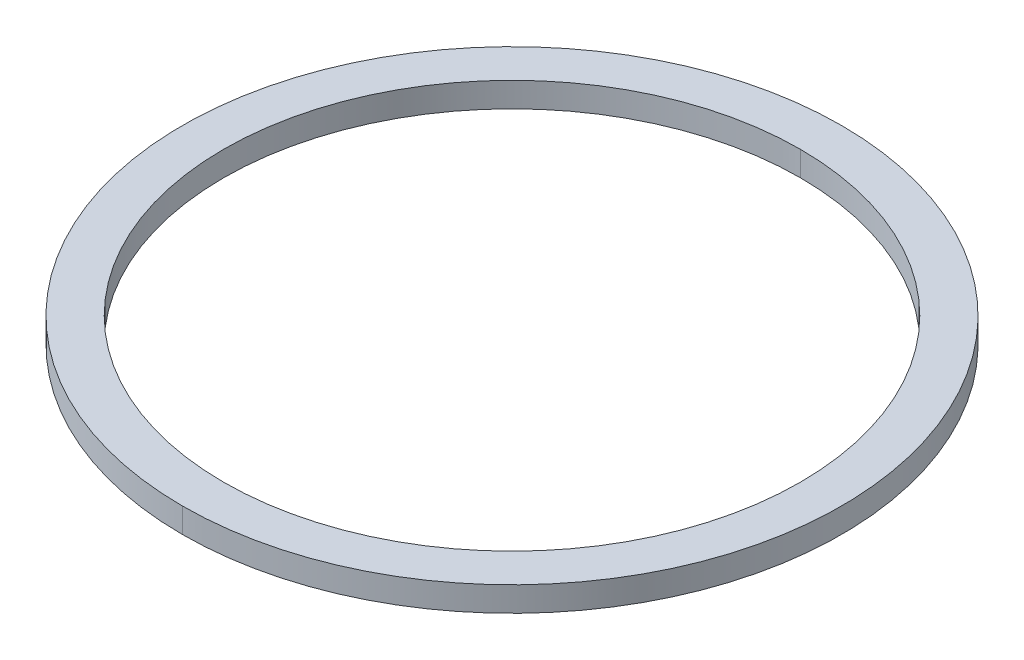
ISO-10303-21;
HEADER;
FILE_DESCRIPTION(('STEP AP214'),'2;1');
FILE_NAME('part.step','',(''),(''),'','','');
FILE_SCHEMA(('AUTOMOTIVE_DESIGN { 1 0 10303 214 1 1 1 1 }'));
ENDSEC;
DATA;
#1=APPLICATION_CONTEXT('core data for automotive mechanical design processes');
#2=APPLICATION_PROTOCOL_DEFINITION('international standard','automotive_design',2000,#1);
#3=PRODUCT_CONTEXT('',#1,'mechanical');
#4=PRODUCT('Part','Part','',(#3));
#5=PRODUCT_RELATED_PRODUCT_CATEGORY('part','',(#4));
#6=PRODUCT_DEFINITION_FORMATION('','',#4);
#7=PRODUCT_DEFINITION_CONTEXT('part definition',#1,'design');
#8=PRODUCT_DEFINITION('design','',#6,#7);
#9=PRODUCT_DEFINITION_SHAPE('','',#8);
#10=(LENGTH_UNIT() NAMED_UNIT(*) SI_UNIT(.MILLI.,.METRE.));
#11=(NAMED_UNIT(*) PLANE_ANGLE_UNIT() SI_UNIT($,.RADIAN.));
#12=(NAMED_UNIT(*) SI_UNIT($,.STERADIAN.) SOLID_ANGLE_UNIT());
#13=UNCERTAINTY_MEASURE_WITH_UNIT(LENGTH_MEASURE(1.E-05),#10,'distance_accuracy_value','');
#14=(GEOMETRIC_REPRESENTATION_CONTEXT(3) GLOBAL_UNCERTAINTY_ASSIGNED_CONTEXT((#13)) GLOBAL_UNIT_ASSIGNED_CONTEXT((#10,
#11,#12)) REPRESENTATION_CONTEXT('',''));
#15=CARTESIAN_POINT('',(0.,0.,0.));
#16=DIRECTION('',(0.,0.,1.));
#17=DIRECTION('',(1.,0.,0.));
#18=AXIS2_PLACEMENT_3D('',#15,#16,#17);
#19=CARTESIAN_POINT('',(0.,1.5,0.));
#20=DIRECTION('',(0.,-1.,0.));
#21=DIRECTION('',(0.,0.,-1.));
#22=AXIS2_PLACEMENT_3D('',#19,#20,#21);
#23=CYLINDRICAL_SURFACE('',#22,17.5);
#24=DIRECTION('',(0.,-1.,0.));
#25=VECTOR('',#24,1.);
#26=CARTESIAN_POINT('',(0.,1.5,17.5));
#27=LINE('',#26,#25);
#28=CARTESIAN_POINT('',(0.,1.5,17.5));
#29=VERTEX_POINT('',#28);
#30=CARTESIAN_POINT('',(0.,0.,17.5));
#31=VERTEX_POINT('',#30);
#32=EDGE_CURVE('E87',#29,#31,#27,.T.);
#33=ORIENTED_EDGE('',*,*,#32,.F.);
#34=CARTESIAN_POINT('',(0.,1.5,0.));
#35=DIRECTION('',(0.,1.,0.));
#36=DIRECTION('',(0.,0.,1.));
#37=AXIS2_PLACEMENT_3D('',#34,#35,#36);
#38=CIRCLE('',#37,17.5);
#39=CARTESIAN_POINT('',(0.,1.5,-17.5));
#40=VERTEX_POINT('',#39);
#41=EDGE_CURVE('E78',#29,#40,#38,.T.);
#42=ORIENTED_EDGE('',*,*,#41,.T.);
#43=DIRECTION('',(0.,-1.,0.));
#44=VECTOR('',#43,1.);
#45=CARTESIAN_POINT('',(0.,1.5,-17.5));
#46=LINE('',#45,#44);
#47=CARTESIAN_POINT('',(0.,0.,-17.5));
#48=VERTEX_POINT('',#47);
#49=EDGE_CURVE('E77',#40,#48,#46,.T.);
#50=ORIENTED_EDGE('',*,*,#49,.T.);
#51=CARTESIAN_POINT('',(0.,0.,0.));
#52=DIRECTION('',(0.,1.,0.));
#53=DIRECTION('',(0.,0.,1.));
#54=AXIS2_PLACEMENT_3D('',#51,#52,#53);
#55=CIRCLE('',#54,17.5);
#56=EDGE_CURVE('E11',#31,#48,#55,.T.);
#57=ORIENTED_EDGE('',*,*,#56,.F.);
#58=EDGE_LOOP('',(#33,#42,#50,#57));
#59=FACE_BOUND('',#58,.T.);
#60=ADVANCED_FACE('F17',(#59),#23,.F.);
#61=CARTESIAN_POINT('',(0.,1.5,0.));
#62=DIRECTION('',(0.,-1.,0.));
#63=DIRECTION('',(0.,0.,-1.));
#64=AXIS2_PLACEMENT_3D('',#61,#62,#63);
#65=CYLINDRICAL_SURFACE('',#64,20.);
#66=DIRECTION('',(0.,-1.,0.));
#67=VECTOR('',#66,1.);
#68=CARTESIAN_POINT('',(0.,1.5,20.));
#69=LINE('',#68,#67);
#70=CARTESIAN_POINT('',(0.,1.5,20.));
#71=VERTEX_POINT('',#70);
#72=CARTESIAN_POINT('',(0.,0.,20.));
#73=VERTEX_POINT('',#72);
#74=EDGE_CURVE('E105',#71,#73,#69,.T.);
#75=ORIENTED_EDGE('',*,*,#74,.F.);
#76=CARTESIAN_POINT('',(0.,1.5,0.));
#77=DIRECTION('',(0.,1.,0.));
#78=DIRECTION('',(0.,0.,1.));
#79=AXIS2_PLACEMENT_3D('',#76,#77,#78);
#80=CIRCLE('',#79,20.);
#81=CARTESIAN_POINT('',(0.,1.5,-20.));
#82=VERTEX_POINT('',#81);
#83=EDGE_CURVE('E115',#82,#71,#80,.T.);
#84=ORIENTED_EDGE('',*,*,#83,.F.);
#85=DIRECTION('',(0.,-1.,0.));
#86=VECTOR('',#85,1.);
#87=CARTESIAN_POINT('',(0.,1.5,-20.));
#88=LINE('',#87,#86);
#89=CARTESIAN_POINT('',(0.,0.,-20.));
#90=VERTEX_POINT('',#89);
#91=EDGE_CURVE('E100',#82,#90,#88,.T.);
#92=ORIENTED_EDGE('',*,*,#91,.T.);
#93=CARTESIAN_POINT('',(0.,0.,0.));
#94=DIRECTION('',(0.,1.,0.));
#95=DIRECTION('',(0.,0.,1.));
#96=AXIS2_PLACEMENT_3D('',#93,#94,#95);
#97=CIRCLE('',#96,20.);
#98=EDGE_CURVE('E25',#90,#73,#97,.T.);
#99=ORIENTED_EDGE('',*,*,#98,.T.);
#100=EDGE_LOOP('',(#75,#84,#92,#99));
#101=FACE_BOUND('',#100,.T.);
#102=ADVANCED_FACE('F161',(#101),#65,.T.);
#103=CARTESIAN_POINT('',(0.,0.,0.));
#104=DIRECTION('',(0.,1.,0.));
#105=DIRECTION('',(1.,0.,0.));
#106=AXIS2_PLACEMENT_3D('',#103,#104,#105);
#107=PLANE('',#106);
#108=CARTESIAN_POINT('',(0.,0.,0.));
#109=DIRECTION('',(0.,1.,0.));
#110=DIRECTION('',(0.,0.,1.));
#111=AXIS2_PLACEMENT_3D('',#108,#109,#110);
#112=CIRCLE('',#111,17.5);
#113=EDGE_CURVE('E73',#48,#31,#112,.T.);
#114=ORIENTED_EDGE('',*,*,#113,.T.);
#115=ORIENTED_EDGE('',*,*,#56,.T.);
#116=EDGE_LOOP('',(#114,#115));
#117=FACE_BOUND('',#116,.T.);
#118=ORIENTED_EDGE('',*,*,#98,.F.);
#119=CARTESIAN_POINT('',(0.,0.,0.));
#120=DIRECTION('',(0.,1.,0.));
#121=DIRECTION('',(0.,0.,1.));
#122=AXIS2_PLACEMENT_3D('',#119,#120,#121);
#123=CIRCLE('',#122,20.);
#124=EDGE_CURVE('E107',#73,#90,#123,.T.);
#125=ORIENTED_EDGE('',*,*,#124,.F.);
#126=EDGE_LOOP('',(#118,#125));
#127=FACE_BOUND('',#126,.T.);
#128=ADVANCED_FACE('F75',(#117,#127),#107,.F.);
#129=CARTESIAN_POINT('',(0.,1.5,0.));
#130=DIRECTION('',(0.,1.,0.));
#131=DIRECTION('',(1.,0.,0.));
#132=AXIS2_PLACEMENT_3D('',#129,#130,#131);
#133=PLANE('',#132);
#134=CARTESIAN_POINT('',(0.,1.5,0.));
#135=DIRECTION('',(0.,1.,0.));
#136=DIRECTION('',(0.,0.,1.));
#137=AXIS2_PLACEMENT_3D('',#134,#135,#136);
#138=CIRCLE('',#137,17.5);
#139=EDGE_CURVE('E94',#40,#29,#138,.T.);
#140=ORIENTED_EDGE('',*,*,#139,.F.);
#141=ORIENTED_EDGE('',*,*,#41,.F.);
#142=EDGE_LOOP('',(#140,#141));
#143=FACE_BOUND('',#142,.T.);
#144=ORIENTED_EDGE('',*,*,#83,.T.);
#145=CARTESIAN_POINT('',(0.,1.5,0.));
#146=DIRECTION('',(0.,1.,0.));
#147=DIRECTION('',(0.,0.,1.));
#148=AXIS2_PLACEMENT_3D('',#145,#146,#147);
#149=CIRCLE('',#148,20.);
#150=EDGE_CURVE('E81',#71,#82,#149,.T.);
#151=ORIENTED_EDGE('',*,*,#150,.T.);
#152=EDGE_LOOP('',(#144,#151));
#153=FACE_BOUND('',#152,.T.);
#154=ADVANCED_FACE('F142',(#143,#153),#133,.T.);
#155=CARTESIAN_POINT('',(0.,1.5,0.));
#156=DIRECTION('',(0.,-1.,0.));
#157=DIRECTION('',(0.,0.,-1.));
#158=AXIS2_PLACEMENT_3D('',#155,#156,#157);
#159=CYLINDRICAL_SURFACE('',#158,20.);
#160=ORIENTED_EDGE('',*,*,#150,.F.);
#161=ORIENTED_EDGE('',*,*,#74,.T.);
#162=ORIENTED_EDGE('',*,*,#124,.T.);
#163=ORIENTED_EDGE('',*,*,#91,.F.);
#164=EDGE_LOOP('',(#160,#161,#162,#163));
#165=FACE_BOUND('',#164,.T.);
#166=ADVANCED_FACE('F135',(#165),#159,.T.);
#167=CARTESIAN_POINT('',(0.,1.5,0.));
#168=DIRECTION('',(0.,-1.,0.));
#169=DIRECTION('',(0.,0.,-1.));
#170=AXIS2_PLACEMENT_3D('',#167,#168,#169);
#171=CYLINDRICAL_SURFACE('',#170,17.5);
#172=ORIENTED_EDGE('',*,*,#139,.T.);
#173=ORIENTED_EDGE('',*,*,#32,.T.);
#174=ORIENTED_EDGE('',*,*,#113,.F.);
#175=ORIENTED_EDGE('',*,*,#49,.F.);
#176=EDGE_LOOP('',(#172,#173,#174,#175));
#177=FACE_BOUND('',#176,.T.);
#178=ADVANCED_FACE('F88',(#177),#171,.F.);
#179=CLOSED_SHELL('',(#60,#102,#128,#154,#166,#178));
#180=MANIFOLD_SOLID_BREP('B1',#179);
#181=ADVANCED_BREP_SHAPE_REPRESENTATION('',(#18,#180),#14);
#182=SHAPE_DEFINITION_REPRESENTATION(#9,#181);
ENDSEC;
END-ISO-10303-21;
